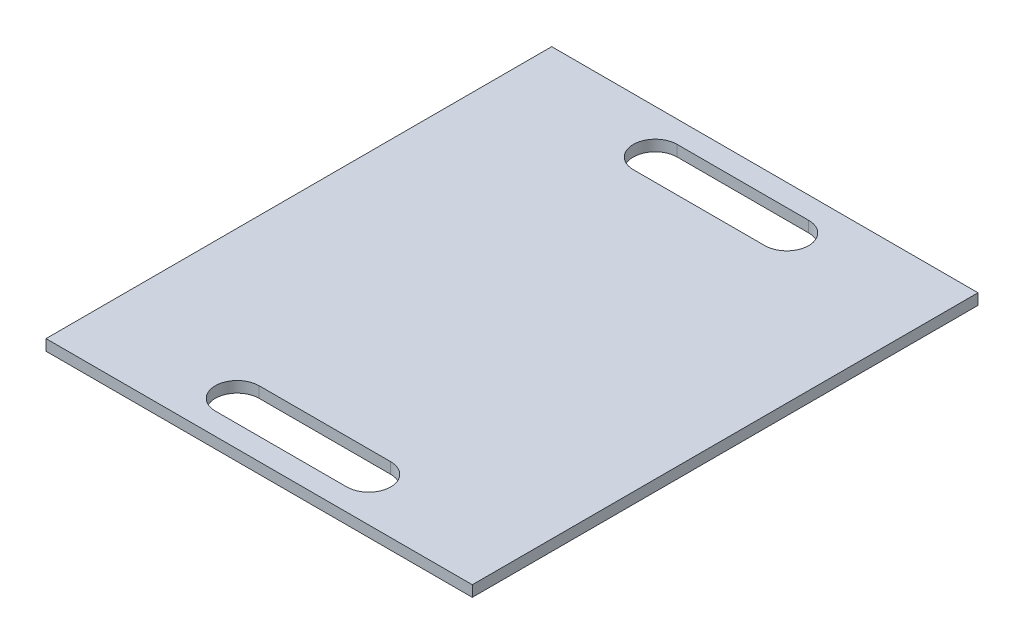
ISO-10303-21;
HEADER;
FILE_DESCRIPTION(('STEP AP214'),'2;1');
FILE_NAME('part.step','',(''),(''),'','','');
FILE_SCHEMA(('AUTOMOTIVE_DESIGN { 1 0 10303 214 1 1 1 1 }'));
ENDSEC;
DATA;
#1=APPLICATION_CONTEXT('core data for automotive mechanical design processes');
#2=APPLICATION_PROTOCOL_DEFINITION('international standard','automotive_design',2000,#1);
#3=PRODUCT_CONTEXT('',#1,'mechanical');
#4=PRODUCT('Part','Part','',(#3));
#5=PRODUCT_RELATED_PRODUCT_CATEGORY('part','',(#4));
#6=PRODUCT_DEFINITION_FORMATION('','',#4);
#7=PRODUCT_DEFINITION_CONTEXT('part definition',#1,'design');
#8=PRODUCT_DEFINITION('design','',#6,#7);
#9=PRODUCT_DEFINITION_SHAPE('','',#8);
#10=(LENGTH_UNIT() NAMED_UNIT(*) SI_UNIT(.MILLI.,.METRE.));
#11=(NAMED_UNIT(*) PLANE_ANGLE_UNIT() SI_UNIT($,.RADIAN.));
#12=(NAMED_UNIT(*) SI_UNIT($,.STERADIAN.) SOLID_ANGLE_UNIT());
#13=UNCERTAINTY_MEASURE_WITH_UNIT(LENGTH_MEASURE(1.E-05),#10,'distance_accuracy_value','');
#14=(GEOMETRIC_REPRESENTATION_CONTEXT(3) GLOBAL_UNCERTAINTY_ASSIGNED_CONTEXT((#13)) GLOBAL_UNIT_ASSIGNED_CONTEXT((#10,
#11,#12)) REPRESENTATION_CONTEXT('',''));
#15=CARTESIAN_POINT('',(0.,0.,0.));
#16=DIRECTION('',(0.,0.,1.));
#17=DIRECTION('',(1.,0.,0.));
#18=AXIS2_PLACEMENT_3D('',#15,#16,#17);
#19=CARTESIAN_POINT('',(123.5,3.175,146.5));
#20=DIRECTION('',(-1.,0.,0.));
#21=DIRECTION('',(0.,0.,1.));
#22=AXIS2_PLACEMENT_3D('',#19,#20,#21);
#23=PLANE('',#22);
#24=DIRECTION('',(0.,0.,-1.));
#25=VECTOR('',#24,1.);
#26=CARTESIAN_POINT('',(123.5,-3.175,146.5));
#27=LINE('',#26,#25);
#28=CARTESIAN_POINT('',(123.5,-3.175,146.5));
#29=VERTEX_POINT('',#28);
#30=CARTESIAN_POINT('',(123.5,-3.175,-146.5));
#31=VERTEX_POINT('',#30);
#32=EDGE_CURVE('E165',#29,#31,#27,.T.);
#33=ORIENTED_EDGE('',*,*,#32,.T.);
#34=DIRECTION('',(0.,-1.,0.));
#35=VECTOR('',#34,1.);
#36=CARTESIAN_POINT('',(123.5,3.175,-146.5));
#37=LINE('',#36,#35);
#38=CARTESIAN_POINT('',(123.5,3.175,-146.5));
#39=VERTEX_POINT('',#38);
#40=EDGE_CURVE('E11',#39,#31,#37,.T.);
#41=ORIENTED_EDGE('',*,*,#40,.F.);
#42=DIRECTION('',(0.,0.,-1.));
#43=VECTOR('',#42,1.);
#44=CARTESIAN_POINT('',(123.5,3.175,146.5));
#45=LINE('',#44,#43);
#46=CARTESIAN_POINT('',(123.5,3.175,146.5));
#47=VERTEX_POINT('',#46);
#48=EDGE_CURVE('E199',#47,#39,#45,.T.);
#49=ORIENTED_EDGE('',*,*,#48,.F.);
#50=DIRECTION('',(0.,-1.,0.));
#51=VECTOR('',#50,1.);
#52=CARTESIAN_POINT('',(123.5,3.175,146.5));
#53=LINE('',#52,#51);
#54=EDGE_CURVE('E209',#47,#29,#53,.T.);
#55=ORIENTED_EDGE('',*,*,#54,.T.);
#56=EDGE_LOOP('',(#33,#41,#49,#55));
#57=FACE_BOUND('',#56,.T.);
#58=ADVANCED_FACE('F41',(#57),#23,.F.);
#59=CARTESIAN_POINT('',(-123.5,3.175,-146.5));
#60=DIRECTION('',(0.,0.,1.));
#61=DIRECTION('',(1.,0.,0.));
#62=AXIS2_PLACEMENT_3D('',#59,#60,#61);
#63=PLANE('',#62);
#64=DIRECTION('',(-1.,0.,0.));
#65=VECTOR('',#64,1.);
#66=CARTESIAN_POINT('',(-123.5,-3.175,-146.5));
#67=LINE('',#66,#65);
#68=CARTESIAN_POINT('',(-123.5,-3.175,-146.5));
#69=VERTEX_POINT('',#68);
#70=EDGE_CURVE('E212',#31,#69,#67,.T.);
#71=ORIENTED_EDGE('',*,*,#70,.T.);
#72=DIRECTION('',(0.,-1.,0.));
#73=VECTOR('',#72,1.);
#74=CARTESIAN_POINT('',(-123.5,3.175,-146.5));
#75=LINE('',#74,#73);
#76=CARTESIAN_POINT('',(-123.5,3.175,-146.5));
#77=VERTEX_POINT('',#76);
#78=EDGE_CURVE('E48',#77,#69,#75,.T.);
#79=ORIENTED_EDGE('',*,*,#78,.F.);
#80=DIRECTION('',(-1.,0.,0.));
#81=VECTOR('',#80,1.);
#82=CARTESIAN_POINT('',(-123.5,3.175,-146.5));
#83=LINE('',#82,#81);
#84=EDGE_CURVE('E202',#39,#77,#83,.T.);
#85=ORIENTED_EDGE('',*,*,#84,.F.);
#86=ORIENTED_EDGE('',*,*,#40,.T.);
#87=EDGE_LOOP('',(#71,#79,#85,#86));
#88=FACE_BOUND('',#87,.T.);
#89=ADVANCED_FACE('F241',(#88),#63,.F.);
#90=CARTESIAN_POINT('',(-123.5,3.175,146.5));
#91=DIRECTION('',(1.,0.,0.));
#92=DIRECTION('',(0.,0.,-1.));
#93=AXIS2_PLACEMENT_3D('',#90,#91,#92);
#94=PLANE('',#93);
#95=DIRECTION('',(0.,0.,1.));
#96=VECTOR('',#95,1.);
#97=CARTESIAN_POINT('',(-123.5,-3.175,146.5));
#98=LINE('',#97,#96);
#99=CARTESIAN_POINT('',(-123.5,-3.175,146.5));
#100=VERTEX_POINT('',#99);
#101=EDGE_CURVE('E214',#69,#100,#98,.T.);
#102=ORIENTED_EDGE('',*,*,#101,.T.);
#103=DIRECTION('',(0.,-1.,0.));
#104=VECTOR('',#103,1.);
#105=CARTESIAN_POINT('',(-123.5,3.175,146.5));
#106=LINE('',#105,#104);
#107=CARTESIAN_POINT('',(-123.5,3.175,146.5));
#108=VERTEX_POINT('',#107);
#109=EDGE_CURVE('E219',#108,#100,#106,.T.);
#110=ORIENTED_EDGE('',*,*,#109,.F.);
#111=DIRECTION('',(0.,0.,1.));
#112=VECTOR('',#111,1.);
#113=CARTESIAN_POINT('',(-123.5,3.175,146.5));
#114=LINE('',#113,#112);
#115=EDGE_CURVE('E205',#77,#108,#114,.T.);
#116=ORIENTED_EDGE('',*,*,#115,.F.);
#117=ORIENTED_EDGE('',*,*,#78,.T.);
#118=EDGE_LOOP('',(#102,#110,#116,#117));
#119=FACE_BOUND('',#118,.T.);
#120=ADVANCED_FACE('F226',(#119),#94,.F.);
#121=CARTESIAN_POINT('',(-123.5,3.175,146.5));
#122=DIRECTION('',(0.,0.,-1.));
#123=DIRECTION('',(-1.,0.,0.));
#124=AXIS2_PLACEMENT_3D('',#121,#122,#123);
#125=PLANE('',#124);
#126=DIRECTION('',(1.,0.,0.));
#127=VECTOR('',#126,1.);
#128=CARTESIAN_POINT('',(-123.5,-3.175,146.5));
#129=LINE('',#128,#127);
#130=EDGE_CURVE('E203',#100,#29,#129,.T.);
#131=ORIENTED_EDGE('',*,*,#130,.T.);
#132=ORIENTED_EDGE('',*,*,#54,.F.);
#133=DIRECTION('',(1.,0.,0.));
#134=VECTOR('',#133,1.);
#135=CARTESIAN_POINT('',(-123.5,3.175,146.5));
#136=LINE('',#135,#134);
#137=EDGE_CURVE('E207',#108,#47,#136,.T.);
#138=ORIENTED_EDGE('',*,*,#137,.F.);
#139=ORIENTED_EDGE('',*,*,#109,.T.);
#140=EDGE_LOOP('',(#131,#132,#138,#139));
#141=FACE_BOUND('',#140,.T.);
#142=ADVANCED_FACE('F234',(#141),#125,.F.);
#143=CARTESIAN_POINT('',(0.,3.175,0.));
#144=DIRECTION('',(0.,-1.,0.));
#145=DIRECTION('',(0.,0.,-1.));
#146=AXIS2_PLACEMENT_3D('',#143,#144,#145);
#147=PLANE('',#146);
#148=DIRECTION('',(1.,0.,0.));
#149=VECTOR('',#148,1.);
#150=CARTESIAN_POINT('',(-38.1,3.175,-108.4));
#151=LINE('',#150,#149);
#152=CARTESIAN_POINT('',(-38.1,3.175,-108.4));
#153=VERTEX_POINT('',#152);
#154=CARTESIAN_POINT('',(38.1,3.175,-108.4));
#155=VERTEX_POINT('',#154);
#156=EDGE_CURVE('E159',#153,#155,#151,.T.);
#157=ORIENTED_EDGE('',*,*,#156,.F.);
#158=CARTESIAN_POINT('',(-38.1,3.175,-121.1));
#159=DIRECTION('',(0.,1.,0.));
#160=DIRECTION('',(0.,0.,1.));
#161=AXIS2_PLACEMENT_3D('',#158,#159,#160);
#162=CIRCLE('',#161,12.7);
#163=CARTESIAN_POINT('',(-38.1,3.175,-133.8));
#164=VERTEX_POINT('',#163);
#165=EDGE_CURVE('E55',#164,#153,#162,.T.);
#166=ORIENTED_EDGE('',*,*,#165,.F.);
#167=DIRECTION('',(-1.,0.,0.));
#168=VECTOR('',#167,1.);
#169=CARTESIAN_POINT('',(-38.1,3.175,-133.8));
#170=LINE('',#169,#168);
#171=CARTESIAN_POINT('',(38.1,3.175,-133.8));
#172=VERTEX_POINT('',#171);
#173=EDGE_CURVE('E150',#172,#164,#170,.T.);
#174=ORIENTED_EDGE('',*,*,#173,.F.);
#175=CARTESIAN_POINT('',(38.1,3.175,-121.1));
#176=DIRECTION('',(0.,1.,0.));
#177=DIRECTION('',(0.,0.,1.));
#178=AXIS2_PLACEMENT_3D('',#175,#176,#177);
#179=CIRCLE('',#178,12.7);
#180=EDGE_CURVE('E153',#155,#172,#179,.T.);
#181=ORIENTED_EDGE('',*,*,#180,.F.);
#182=EDGE_LOOP('',(#157,#166,#174,#181));
#183=FACE_BOUND('',#182,.T.);
#184=DIRECTION('',(1.,0.,0.));
#185=VECTOR('',#184,1.);
#186=CARTESIAN_POINT('',(-38.1,3.175,133.8));
#187=LINE('',#186,#185);
#188=CARTESIAN_POINT('',(-38.1,3.175,133.8));
#189=VERTEX_POINT('',#188);
#190=CARTESIAN_POINT('',(38.1,3.175,133.8));
#191=VERTEX_POINT('',#190);
#192=EDGE_CURVE('E185',#189,#191,#187,.T.);
#193=ORIENTED_EDGE('',*,*,#192,.F.);
#194=CARTESIAN_POINT('',(-38.1,3.175,121.1));
#195=DIRECTION('',(0.,1.,0.));
#196=DIRECTION('',(0.,0.,-1.));
#197=AXIS2_PLACEMENT_3D('',#194,#195,#196);
#198=CIRCLE('',#197,12.7);
#199=CARTESIAN_POINT('',(-38.1,3.175,108.4));
#200=VERTEX_POINT('',#199);
#201=EDGE_CURVE('E63',#200,#189,#198,.T.);
#202=ORIENTED_EDGE('',*,*,#201,.F.);
#203=DIRECTION('',(-1.,0.,0.));
#204=VECTOR('',#203,1.);
#205=CARTESIAN_POINT('',(-38.1,3.175,108.4));
#206=LINE('',#205,#204);
#207=CARTESIAN_POINT('',(38.1,3.175,108.4));
#208=VERTEX_POINT('',#207);
#209=EDGE_CURVE('E178',#208,#200,#206,.T.);
#210=ORIENTED_EDGE('',*,*,#209,.F.);
#211=CARTESIAN_POINT('',(38.1,3.175,121.1));
#212=DIRECTION('',(0.,1.,0.));
#213=DIRECTION('',(0.,0.,-1.));
#214=AXIS2_PLACEMENT_3D('',#211,#212,#213);
#215=CIRCLE('',#214,12.7);
#216=EDGE_CURVE('E181',#191,#208,#215,.T.);
#217=ORIENTED_EDGE('',*,*,#216,.F.);
#218=EDGE_LOOP('',(#193,#202,#210,#217));
#219=FACE_BOUND('',#218,.T.);
#220=ORIENTED_EDGE('',*,*,#48,.T.);
#221=ORIENTED_EDGE('',*,*,#84,.T.);
#222=ORIENTED_EDGE('',*,*,#115,.T.);
#223=ORIENTED_EDGE('',*,*,#137,.T.);
#224=EDGE_LOOP('',(#220,#221,#222,#223));
#225=FACE_BOUND('',#224,.T.);
#226=ADVANCED_FACE('F240',(#183,#219,#225),#147,.F.);
#227=CARTESIAN_POINT('',(0.,-3.175,0.));
#228=DIRECTION('',(0.,-1.,0.));
#229=DIRECTION('',(0.,0.,-1.));
#230=AXIS2_PLACEMENT_3D('',#227,#228,#229);
#231=PLANE('',#230);
#232=CARTESIAN_POINT('',(-38.1,-3.175,-121.1));
#233=DIRECTION('',(0.,1.,0.));
#234=DIRECTION('',(0.,0.,1.));
#235=AXIS2_PLACEMENT_3D('',#232,#233,#234);
#236=CIRCLE('',#235,12.7);
#237=CARTESIAN_POINT('',(-38.1,-3.175,-133.8));
#238=VERTEX_POINT('',#237);
#239=CARTESIAN_POINT('',(-38.1,-3.175,-108.4));
#240=VERTEX_POINT('',#239);
#241=EDGE_CURVE('E131',#238,#240,#236,.T.);
#242=ORIENTED_EDGE('',*,*,#241,.T.);
#243=DIRECTION('',(1.,0.,0.));
#244=VECTOR('',#243,1.);
#245=CARTESIAN_POINT('',(-38.1,-3.175,-108.4));
#246=LINE('',#245,#244);
#247=CARTESIAN_POINT('',(38.1,-3.175,-108.4));
#248=VERTEX_POINT('',#247);
#249=EDGE_CURVE('E141',#240,#248,#246,.T.);
#250=ORIENTED_EDGE('',*,*,#249,.T.);
#251=CARTESIAN_POINT('',(38.1,-3.175,-121.1));
#252=DIRECTION('',(0.,1.,0.));
#253=DIRECTION('',(0.,0.,1.));
#254=AXIS2_PLACEMENT_3D('',#251,#252,#253);
#255=CIRCLE('',#254,12.7);
#256=CARTESIAN_POINT('',(38.1,-3.175,-133.8));
#257=VERTEX_POINT('',#256);
#258=EDGE_CURVE('E145',#248,#257,#255,.T.);
#259=ORIENTED_EDGE('',*,*,#258,.T.);
#260=DIRECTION('',(-1.,0.,0.));
#261=VECTOR('',#260,1.);
#262=CARTESIAN_POINT('',(-38.1,-3.175,-133.8));
#263=LINE('',#262,#261);
#264=EDGE_CURVE('E137',#257,#238,#263,.T.);
#265=ORIENTED_EDGE('',*,*,#264,.T.);
#266=EDGE_LOOP('',(#242,#250,#259,#265));
#267=FACE_BOUND('',#266,.T.);
#268=CARTESIAN_POINT('',(-38.1,-3.175,121.1));
#269=DIRECTION('',(0.,1.,0.));
#270=DIRECTION('',(0.,0.,-1.));
#271=AXIS2_PLACEMENT_3D('',#268,#269,#270);
#272=CIRCLE('',#271,12.7);
#273=CARTESIAN_POINT('',(-38.1,-3.175,108.4));
#274=VERTEX_POINT('',#273);
#275=CARTESIAN_POINT('',(-38.1,-3.175,133.8));
#276=VERTEX_POINT('',#275);
#277=EDGE_CURVE('E182',#274,#276,#272,.T.);
#278=ORIENTED_EDGE('',*,*,#277,.T.);
#279=DIRECTION('',(1.,0.,0.));
#280=VECTOR('',#279,1.);
#281=CARTESIAN_POINT('',(-38.1,-3.175,133.8));
#282=LINE('',#281,#280);
#283=CARTESIAN_POINT('',(38.1,-3.175,133.8));
#284=VERTEX_POINT('',#283);
#285=EDGE_CURVE('E194',#276,#284,#282,.T.);
#286=ORIENTED_EDGE('',*,*,#285,.T.);
#287=CARTESIAN_POINT('',(38.1,-3.175,121.1));
#288=DIRECTION('',(0.,1.,0.));
#289=DIRECTION('',(0.,0.,-1.));
#290=AXIS2_PLACEMENT_3D('',#287,#288,#289);
#291=CIRCLE('',#290,12.7);
#292=CARTESIAN_POINT('',(38.1,-3.175,108.4));
#293=VERTEX_POINT('',#292);
#294=EDGE_CURVE('E191',#284,#293,#291,.T.);
#295=ORIENTED_EDGE('',*,*,#294,.T.);
#296=DIRECTION('',(-1.,0.,0.));
#297=VECTOR('',#296,1.);
#298=CARTESIAN_POINT('',(-38.1,-3.175,108.4));
#299=LINE('',#298,#297);
#300=EDGE_CURVE('E171',#293,#274,#299,.T.);
#301=ORIENTED_EDGE('',*,*,#300,.T.);
#302=EDGE_LOOP('',(#278,#286,#295,#301));
#303=FACE_BOUND('',#302,.T.);
#304=ORIENTED_EDGE('',*,*,#32,.F.);
#305=ORIENTED_EDGE('',*,*,#130,.F.);
#306=ORIENTED_EDGE('',*,*,#101,.F.);
#307=ORIENTED_EDGE('',*,*,#70,.F.);
#308=EDGE_LOOP('',(#304,#305,#306,#307));
#309=FACE_BOUND('',#308,.T.);
#310=ADVANCED_FACE('F147',(#267,#303,#309),#231,.T.);
#311=CARTESIAN_POINT('',(-38.1,-3.175,121.1));
#312=DIRECTION('',(0.,1.,0.));
#313=DIRECTION('',(0.,0.,1.));
#314=AXIS2_PLACEMENT_3D('',#311,#312,#313);
#315=CYLINDRICAL_SURFACE('',#314,12.7);
#316=ORIENTED_EDGE('',*,*,#201,.T.);
#317=DIRECTION('',(0.,1.,0.));
#318=VECTOR('',#317,1.);
#319=CARTESIAN_POINT('',(-38.1,-3.175,133.8));
#320=LINE('',#319,#318);
#321=EDGE_CURVE('E169',#276,#189,#320,.T.);
#322=ORIENTED_EDGE('',*,*,#321,.F.);
#323=ORIENTED_EDGE('',*,*,#277,.F.);
#324=DIRECTION('',(0.,1.,0.));
#325=VECTOR('',#324,1.);
#326=CARTESIAN_POINT('',(-38.1,-3.175,108.4));
#327=LINE('',#326,#325);
#328=EDGE_CURVE('E176',#274,#200,#327,.T.);
#329=ORIENTED_EDGE('',*,*,#328,.T.);
#330=EDGE_LOOP('',(#316,#322,#323,#329));
#331=FACE_BOUND('',#330,.T.);
#332=ADVANCED_FACE('F253',(#331),#315,.F.);
#333=CARTESIAN_POINT('',(-38.1,-3.175,108.4));
#334=DIRECTION('',(0.,0.,-1.));
#335=DIRECTION('',(-1.,0.,0.));
#336=AXIS2_PLACEMENT_3D('',#333,#334,#335);
#337=PLANE('',#336);
#338=ORIENTED_EDGE('',*,*,#209,.T.);
#339=ORIENTED_EDGE('',*,*,#328,.F.);
#340=ORIENTED_EDGE('',*,*,#300,.F.);
#341=DIRECTION('',(0.,1.,0.));
#342=VECTOR('',#341,1.);
#343=CARTESIAN_POINT('',(38.1,-3.175,108.4));
#344=LINE('',#343,#342);
#345=EDGE_CURVE('E174',#293,#208,#344,.T.);
#346=ORIENTED_EDGE('',*,*,#345,.T.);
#347=EDGE_LOOP('',(#338,#339,#340,#346));
#348=FACE_BOUND('',#347,.T.);
#349=ADVANCED_FACE('F257',(#348),#337,.F.);
#350=CARTESIAN_POINT('',(38.1,-3.175,121.1));
#351=DIRECTION('',(0.,1.,0.));
#352=DIRECTION('',(0.,0.,1.));
#353=AXIS2_PLACEMENT_3D('',#350,#351,#352);
#354=CYLINDRICAL_SURFACE('',#353,12.7);
#355=ORIENTED_EDGE('',*,*,#216,.T.);
#356=ORIENTED_EDGE('',*,*,#345,.F.);
#357=ORIENTED_EDGE('',*,*,#294,.F.);
#358=DIRECTION('',(0.,1.,0.));
#359=VECTOR('',#358,1.);
#360=CARTESIAN_POINT('',(38.1,-3.175,133.8));
#361=LINE('',#360,#359);
#362=EDGE_CURVE('E172',#284,#191,#361,.T.);
#363=ORIENTED_EDGE('',*,*,#362,.T.);
#364=EDGE_LOOP('',(#355,#356,#357,#363));
#365=FACE_BOUND('',#364,.T.);
#366=ADVANCED_FACE('F260',(#365),#354,.F.);
#367=CARTESIAN_POINT('',(-38.1,-3.175,133.8));
#368=DIRECTION('',(0.,0.,1.));
#369=DIRECTION('',(1.,0.,0.));
#370=AXIS2_PLACEMENT_3D('',#367,#368,#369);
#371=PLANE('',#370);
#372=ORIENTED_EDGE('',*,*,#192,.T.);
#373=ORIENTED_EDGE('',*,*,#362,.F.);
#374=ORIENTED_EDGE('',*,*,#285,.F.);
#375=ORIENTED_EDGE('',*,*,#321,.T.);
#376=EDGE_LOOP('',(#372,#373,#374,#375));
#377=FACE_BOUND('',#376,.T.);
#378=ADVANCED_FACE('F264',(#377),#371,.F.);
#379=CARTESIAN_POINT('',(-38.1,-3.175,-121.1));
#380=DIRECTION('',(0.,1.,0.));
#381=DIRECTION('',(0.,0.,1.));
#382=AXIS2_PLACEMENT_3D('',#379,#380,#381);
#383=CYLINDRICAL_SURFACE('',#382,12.7);
#384=ORIENTED_EDGE('',*,*,#165,.T.);
#385=DIRECTION('',(0.,1.,0.));
#386=VECTOR('',#385,1.);
#387=CARTESIAN_POINT('',(-38.1,-3.175,-108.4));
#388=LINE('',#387,#386);
#389=EDGE_CURVE('E127',#240,#153,#388,.T.);
#390=ORIENTED_EDGE('',*,*,#389,.F.);
#391=ORIENTED_EDGE('',*,*,#241,.F.);
#392=DIRECTION('',(0.,1.,0.));
#393=VECTOR('',#392,1.);
#394=CARTESIAN_POINT('',(-38.1,-3.175,-133.8));
#395=LINE('',#394,#393);
#396=EDGE_CURVE('E163',#238,#164,#395,.T.);
#397=ORIENTED_EDGE('',*,*,#396,.T.);
#398=EDGE_LOOP('',(#384,#390,#391,#397));
#399=FACE_BOUND('',#398,.T.);
#400=ADVANCED_FACE('F129',(#399),#383,.F.);
#401=CARTESIAN_POINT('',(-38.1,-3.175,-133.8));
#402=DIRECTION('',(0.,0.,-1.));
#403=DIRECTION('',(-1.,0.,0.));
#404=AXIS2_PLACEMENT_3D('',#401,#402,#403);
#405=PLANE('',#404);
#406=ORIENTED_EDGE('',*,*,#173,.T.);
#407=ORIENTED_EDGE('',*,*,#396,.F.);
#408=ORIENTED_EDGE('',*,*,#264,.F.);
#409=DIRECTION('',(0.,1.,0.));
#410=VECTOR('',#409,1.);
#411=CARTESIAN_POINT('',(38.1,-3.175,-133.8));
#412=LINE('',#411,#410);
#413=EDGE_CURVE('E166',#257,#172,#412,.T.);
#414=ORIENTED_EDGE('',*,*,#413,.T.);
#415=EDGE_LOOP('',(#406,#407,#408,#414));
#416=FACE_BOUND('',#415,.T.);
#417=ADVANCED_FACE('F273',(#416),#405,.F.);
#418=CARTESIAN_POINT('',(38.1,-3.175,-121.1));
#419=DIRECTION('',(0.,1.,0.));
#420=DIRECTION('',(0.,0.,1.));
#421=AXIS2_PLACEMENT_3D('',#418,#419,#420);
#422=CYLINDRICAL_SURFACE('',#421,12.7);
#423=ORIENTED_EDGE('',*,*,#180,.T.);
#424=ORIENTED_EDGE('',*,*,#413,.F.);
#425=ORIENTED_EDGE('',*,*,#258,.F.);
#426=DIRECTION('',(0.,1.,0.));
#427=VECTOR('',#426,1.);
#428=CARTESIAN_POINT('',(38.1,-3.175,-108.4));
#429=LINE('',#428,#427);
#430=EDGE_CURVE('E136',#248,#155,#429,.T.);
#431=ORIENTED_EDGE('',*,*,#430,.T.);
#432=EDGE_LOOP('',(#423,#424,#425,#431));
#433=FACE_BOUND('',#432,.T.);
#434=ADVANCED_FACE('F276',(#433),#422,.F.);
#435=CARTESIAN_POINT('',(-38.1,-3.175,-108.4));
#436=DIRECTION('',(0.,0.,1.));
#437=DIRECTION('',(1.,0.,0.));
#438=AXIS2_PLACEMENT_3D('',#435,#436,#437);
#439=PLANE('',#438);
#440=ORIENTED_EDGE('',*,*,#156,.T.);
#441=ORIENTED_EDGE('',*,*,#430,.F.);
#442=ORIENTED_EDGE('',*,*,#249,.F.);
#443=ORIENTED_EDGE('',*,*,#389,.T.);
#444=EDGE_LOOP('',(#440,#441,#442,#443));
#445=FACE_BOUND('',#444,.T.);
#446=ADVANCED_FACE('F142',(#445),#439,.F.);
#447=CLOSED_SHELL('',(#58,#89,#120,#142,#226,#310,#332,#349,#366,#378,#400,#417,#434,#446));
#448=MANIFOLD_SOLID_BREP('B2',#447);
#449=ADVANCED_BREP_SHAPE_REPRESENTATION('',(#18,#448),#14);
#450=SHAPE_DEFINITION_REPRESENTATION(#9,#449);
ENDSEC;
END-ISO-10303-21;
